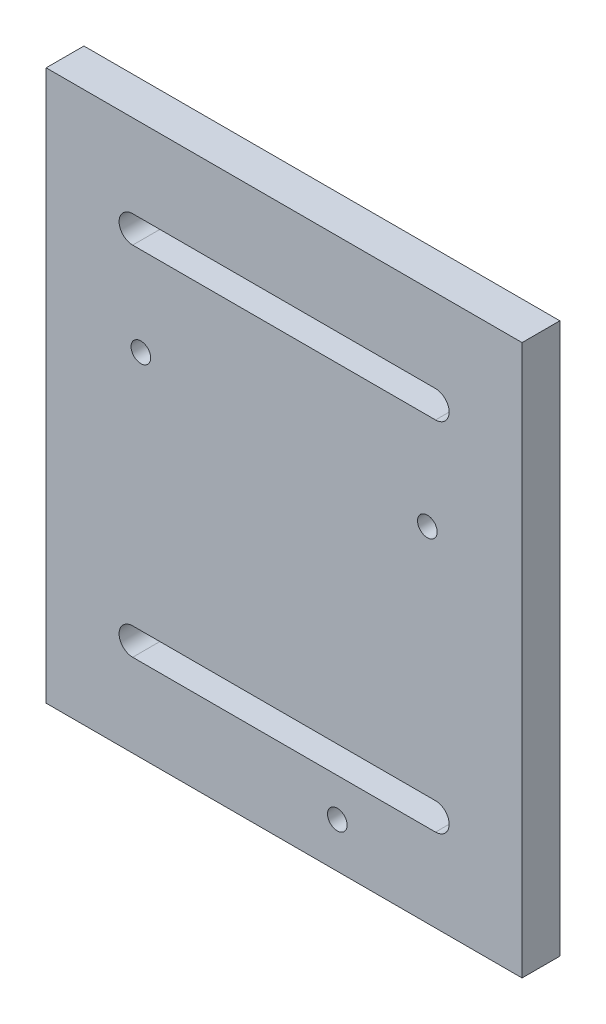
ISO-10303-21;
HEADER;
FILE_DESCRIPTION(('STEP AP214'),'2;1');
FILE_NAME('part.step','',(''),(''),'','','');
FILE_SCHEMA(('AUTOMOTIVE_DESIGN { 1 0 10303 214 1 1 1 1 }'));
ENDSEC;
DATA;
#1=APPLICATION_CONTEXT('core data for automotive mechanical design processes');
#2=APPLICATION_PROTOCOL_DEFINITION('international standard','automotive_design',2000,#1);
#3=PRODUCT_CONTEXT('',#1,'mechanical');
#4=PRODUCT('Part','Part','',(#3));
#5=PRODUCT_RELATED_PRODUCT_CATEGORY('part','',(#4));
#6=PRODUCT_DEFINITION_FORMATION('','',#4);
#7=PRODUCT_DEFINITION_CONTEXT('part definition',#1,'design');
#8=PRODUCT_DEFINITION('design','',#6,#7);
#9=PRODUCT_DEFINITION_SHAPE('','',#8);
#10=(LENGTH_UNIT() NAMED_UNIT(*) SI_UNIT(.MILLI.,.METRE.));
#11=(NAMED_UNIT(*) PLANE_ANGLE_UNIT() SI_UNIT($,.RADIAN.));
#12=(NAMED_UNIT(*) SI_UNIT($,.STERADIAN.) SOLID_ANGLE_UNIT());
#13=UNCERTAINTY_MEASURE_WITH_UNIT(LENGTH_MEASURE(1.E-05),#10,'distance_accuracy_value','');
#14=(GEOMETRIC_REPRESENTATION_CONTEXT(3) GLOBAL_UNCERTAINTY_ASSIGNED_CONTEXT((#13)) GLOBAL_UNIT_ASSIGNED_CONTEXT((#10,
#11,#12)) REPRESENTATION_CONTEXT('',''));
#15=CARTESIAN_POINT('',(0.,0.,0.));
#16=DIRECTION('',(0.,0.,1.));
#17=DIRECTION('',(1.,0.,0.));
#18=AXIS2_PLACEMENT_3D('',#15,#16,#17);
#19=CARTESIAN_POINT('',(0.,0.,6.35));
#20=DIRECTION('',(0.,0.,-1.));
#21=DIRECTION('',(-1.,0.,0.));
#22=AXIS2_PLACEMENT_3D('',#19,#20,#21);
#23=PLANE('',#22);
#24=CARTESIAN_POINT('',(-25.4545454545455,30.,6.35));
#25=DIRECTION('',(0.,0.,1.));
#26=DIRECTION('',(1.,0.,0.));
#27=AXIS2_PLACEMENT_3D('',#24,#25,#26);
#28=CIRCLE('',#27,2.28500000000001);
#29=CARTESIAN_POINT('',(-25.4545454545455,32.285,6.35));
#30=VERTEX_POINT('',#29);
#31=CARTESIAN_POINT('',(-25.4545454545455,27.715,6.35));
#32=VERTEX_POINT('',#31);
#33=EDGE_CURVE('E161',#30,#32,#28,.T.);
#34=ORIENTED_EDGE('',*,*,#33,.F.);
#35=DIRECTION('',(-1.,0.,0.));
#36=VECTOR('',#35,1.);
#37=CARTESIAN_POINT('',(-25.4545454545455,32.285,6.35));
#38=LINE('',#37,#36);
#39=CARTESIAN_POINT('',(25.4545454545455,32.285,6.35));
#40=VERTEX_POINT('',#39);
#41=EDGE_CURVE('E169',#40,#30,#38,.T.);
#42=ORIENTED_EDGE('',*,*,#41,.F.);
#43=CARTESIAN_POINT('',(25.4545454545455,30.,6.35));
#44=DIRECTION('',(0.,0.,1.));
#45=DIRECTION('',(1.,0.,0.));
#46=AXIS2_PLACEMENT_3D('',#43,#44,#45);
#47=CIRCLE('',#46,2.28500000000001);
#48=CARTESIAN_POINT('',(25.4545454545455,27.715,6.35));
#49=VERTEX_POINT('',#48);
#50=EDGE_CURVE('E166',#49,#40,#47,.T.);
#51=ORIENTED_EDGE('',*,*,#50,.F.);
#52=DIRECTION('',(1.,0.,0.));
#53=VECTOR('',#52,1.);
#54=CARTESIAN_POINT('',(-25.4545454545455,27.715,6.35));
#55=LINE('',#54,#53);
#56=EDGE_CURVE('E163',#32,#49,#55,.T.);
#57=ORIENTED_EDGE('',*,*,#56,.F.);
#58=EDGE_LOOP('',(#34,#42,#51,#57));
#59=FACE_BOUND('',#58,.T.);
#60=DIRECTION('',(0.,-1.,0.));
#61=VECTOR('',#60,1.);
#62=CARTESIAN_POINT('',(-40.,-46.25,6.35));
#63=LINE('',#62,#61);
#64=CARTESIAN_POINT('',(-40.,46.25,6.35));
#65=VERTEX_POINT('',#64);
#66=CARTESIAN_POINT('',(-40.,-46.25,6.35));
#67=VERTEX_POINT('',#66);
#68=EDGE_CURVE('E192',#65,#67,#63,.T.);
#69=ORIENTED_EDGE('',*,*,#68,.T.);
#70=DIRECTION('',(1.,0.,0.));
#71=VECTOR('',#70,1.);
#72=CARTESIAN_POINT('',(-40.,-46.25,6.35));
#73=LINE('',#72,#71);
#74=CARTESIAN_POINT('',(40.,-46.25,6.35));
#75=VERTEX_POINT('',#74);
#76=EDGE_CURVE('E195',#67,#75,#73,.T.);
#77=ORIENTED_EDGE('',*,*,#76,.T.);
#78=DIRECTION('',(0.,1.,0.));
#79=VECTOR('',#78,1.);
#80=CARTESIAN_POINT('',(40.,-46.25,6.35));
#81=LINE('',#80,#79);
#82=CARTESIAN_POINT('',(40.,46.25,6.35));
#83=VERTEX_POINT('',#82);
#84=EDGE_CURVE('E198',#75,#83,#81,.T.);
#85=ORIENTED_EDGE('',*,*,#84,.T.);
#86=DIRECTION('',(-1.,0.,0.));
#87=VECTOR('',#86,1.);
#88=CARTESIAN_POINT('',(-40.,46.25,6.35));
#89=LINE('',#88,#87);
#90=EDGE_CURVE('E200',#83,#65,#89,.T.);
#91=ORIENTED_EDGE('',*,*,#90,.T.);
#92=EDGE_LOOP('',(#69,#77,#85,#91));
#93=FACE_BOUND('',#92,.T.);
#94=CARTESIAN_POINT('',(-25.4545454545455,-30.,6.35));
#95=DIRECTION('',(0.,0.,1.));
#96=DIRECTION('',(1.,0.,0.));
#97=AXIS2_PLACEMENT_3D('',#94,#95,#96);
#98=CIRCLE('',#97,2.285);
#99=CARTESIAN_POINT('',(-25.4545454545455,-27.715,6.35));
#100=VERTEX_POINT('',#99);
#101=CARTESIAN_POINT('',(-25.4545454545455,-32.285,6.35));
#102=VERTEX_POINT('',#101);
#103=EDGE_CURVE('E122',#100,#102,#98,.T.);
#104=ORIENTED_EDGE('',*,*,#103,.F.);
#105=DIRECTION('',(-1.,0.,0.));
#106=VECTOR('',#105,1.);
#107=CARTESIAN_POINT('',(-25.4545454545455,-27.715,6.35));
#108=LINE('',#107,#106);
#109=CARTESIAN_POINT('',(25.4545454545455,-27.715,6.35));
#110=VERTEX_POINT('',#109);
#111=EDGE_CURVE('E145',#110,#100,#108,.T.);
#112=ORIENTED_EDGE('',*,*,#111,.F.);
#113=CARTESIAN_POINT('',(25.4545454545455,-30.,6.35));
#114=DIRECTION('',(0.,0.,1.));
#115=DIRECTION('',(1.,0.,0.));
#116=AXIS2_PLACEMENT_3D('',#113,#114,#115);
#117=CIRCLE('',#116,2.285);
#118=CARTESIAN_POINT('',(25.4545454545455,-32.285,6.35));
#119=VERTEX_POINT('',#118);
#120=EDGE_CURVE('E143',#119,#110,#117,.T.);
#121=ORIENTED_EDGE('',*,*,#120,.F.);
#122=DIRECTION('',(1.,0.,0.));
#123=VECTOR('',#122,1.);
#124=CARTESIAN_POINT('',(-25.4545454545455,-32.285,6.35));
#125=LINE('',#124,#123);
#126=EDGE_CURVE('E130',#102,#119,#125,.T.);
#127=ORIENTED_EDGE('',*,*,#126,.F.);
#128=EDGE_LOOP('',(#104,#112,#121,#127));
#129=FACE_BOUND('',#128,.T.);
#130=CARTESIAN_POINT('',(-24.08,12.8,6.35));
#131=DIRECTION('',(0.,0.,1.));
#132=DIRECTION('',(1.,0.,0.));
#133=AXIS2_PLACEMENT_3D('',#130,#131,#132);
#134=CIRCLE('',#133,1.65);
#135=CARTESIAN_POINT('',(-22.43,12.8,6.35));
#136=VERTEX_POINT('',#135);
#137=EDGE_CURVE('E151',#136,#136,#134,.T.);
#138=ORIENTED_EDGE('',*,*,#137,.F.);
#139=EDGE_LOOP('',(#138));
#140=FACE_BOUND('',#139,.T.);
#141=CARTESIAN_POINT('',(24.08,11.53,6.35));
#142=DIRECTION('',(0.,0.,1.));
#143=DIRECTION('',(1.,0.,0.));
#144=AXIS2_PLACEMENT_3D('',#141,#142,#143);
#145=CIRCLE('',#144,1.65);
#146=CARTESIAN_POINT('',(25.73,11.53,6.35));
#147=VERTEX_POINT('',#146);
#148=EDGE_CURVE('E321',#147,#147,#145,.T.);
#149=ORIENTED_EDGE('',*,*,#148,.F.);
#150=EDGE_LOOP('',(#149));
#151=FACE_BOUND('',#150,.T.);
#152=CARTESIAN_POINT('',(8.94,-38.71,6.35));
#153=DIRECTION('',(0.,0.,1.));
#154=DIRECTION('',(1.,0.,0.));
#155=AXIS2_PLACEMENT_3D('',#152,#153,#154);
#156=CIRCLE('',#155,1.65);
#157=CARTESIAN_POINT('',(10.59,-38.71,6.35));
#158=VERTEX_POINT('',#157);
#159=EDGE_CURVE('E312',#158,#158,#156,.T.);
#160=ORIENTED_EDGE('',*,*,#159,.F.);
#161=EDGE_LOOP('',(#160));
#162=FACE_BOUND('',#161,.T.);
#163=ADVANCED_FACE('F33',(#59,#93,#129,#140,#151,#162),#23,.F.);
#164=CARTESIAN_POINT('',(0.,0.,0.));
#165=DIRECTION('',(0.,0.,-1.));
#166=DIRECTION('',(-1.,0.,0.));
#167=AXIS2_PLACEMENT_3D('',#164,#165,#166);
#168=PLANE('',#167);
#169=CARTESIAN_POINT('',(24.08,11.53,0.));
#170=DIRECTION('',(0.,0.,1.));
#171=DIRECTION('',(1.,0.,0.));
#172=AXIS2_PLACEMENT_3D('',#169,#170,#171);
#173=CIRCLE('',#172,1.65);
#174=CARTESIAN_POINT('',(25.73,11.53,0.));
#175=VERTEX_POINT('',#174);
#176=EDGE_CURVE('E318',#175,#175,#173,.T.);
#177=ORIENTED_EDGE('',*,*,#176,.T.);
#178=EDGE_LOOP('',(#177));
#179=FACE_BOUND('',#178,.T.);
#180=DIRECTION('',(-1.,0.,0.));
#181=VECTOR('',#180,1.);
#182=CARTESIAN_POINT('',(-25.4545454545455,-27.715,0.));
#183=LINE('',#182,#181);
#184=CARTESIAN_POINT('',(25.4545454545455,-27.715,0.));
#185=VERTEX_POINT('',#184);
#186=CARTESIAN_POINT('',(-25.4545454545455,-27.715,0.));
#187=VERTEX_POINT('',#186);
#188=EDGE_CURVE('E131',#185,#187,#183,.T.);
#189=ORIENTED_EDGE('',*,*,#188,.T.);
#190=CARTESIAN_POINT('',(-25.4545454545455,-30.,0.));
#191=DIRECTION('',(0.,0.,1.));
#192=DIRECTION('',(1.,0.,0.));
#193=AXIS2_PLACEMENT_3D('',#190,#191,#192);
#194=CIRCLE('',#193,2.285);
#195=CARTESIAN_POINT('',(-25.4545454545455,-32.285,0.));
#196=VERTEX_POINT('',#195);
#197=EDGE_CURVE('E56',#187,#196,#194,.T.);
#198=ORIENTED_EDGE('',*,*,#197,.T.);
#199=DIRECTION('',(1.,0.,0.));
#200=VECTOR('',#199,1.);
#201=CARTESIAN_POINT('',(-25.4545454545455,-32.285,0.));
#202=LINE('',#201,#200);
#203=CARTESIAN_POINT('',(25.4545454545455,-32.285,0.));
#204=VERTEX_POINT('',#203);
#205=EDGE_CURVE('E137',#196,#204,#202,.T.);
#206=ORIENTED_EDGE('',*,*,#205,.T.);
#207=CARTESIAN_POINT('',(25.4545454545455,-30.,0.));
#208=DIRECTION('',(0.,0.,1.));
#209=DIRECTION('',(1.,0.,0.));
#210=AXIS2_PLACEMENT_3D('',#207,#208,#209);
#211=CIRCLE('',#210,2.285);
#212=EDGE_CURVE('E153',#204,#185,#211,.T.);
#213=ORIENTED_EDGE('',*,*,#212,.T.);
#214=EDGE_LOOP('',(#189,#198,#206,#213));
#215=FACE_BOUND('',#214,.T.);
#216=DIRECTION('',(-1.,0.,0.));
#217=VECTOR('',#216,1.);
#218=CARTESIAN_POINT('',(-25.4545454545455,32.285,0.));
#219=LINE('',#218,#217);
#220=CARTESIAN_POINT('',(25.4545454545455,32.285,0.));
#221=VERTEX_POINT('',#220);
#222=CARTESIAN_POINT('',(-25.4545454545455,32.285,0.));
#223=VERTEX_POINT('',#222);
#224=EDGE_CURVE('E164',#221,#223,#219,.T.);
#225=ORIENTED_EDGE('',*,*,#224,.T.);
#226=CARTESIAN_POINT('',(-25.4545454545455,30.,0.));
#227=DIRECTION('',(0.,0.,1.));
#228=DIRECTION('',(1.,0.,0.));
#229=AXIS2_PLACEMENT_3D('',#226,#227,#228);
#230=CIRCLE('',#229,2.28500000000001);
#231=CARTESIAN_POINT('',(-25.4545454545455,27.715,0.));
#232=VERTEX_POINT('',#231);
#233=EDGE_CURVE('E138',#223,#232,#230,.T.);
#234=ORIENTED_EDGE('',*,*,#233,.T.);
#235=DIRECTION('',(1.,0.,0.));
#236=VECTOR('',#235,1.);
#237=CARTESIAN_POINT('',(-25.4545454545455,27.715,0.));
#238=LINE('',#237,#236);
#239=CARTESIAN_POINT('',(25.4545454545455,27.715,0.));
#240=VERTEX_POINT('',#239);
#241=EDGE_CURVE('E174',#232,#240,#238,.T.);
#242=ORIENTED_EDGE('',*,*,#241,.T.);
#243=CARTESIAN_POINT('',(25.4545454545455,30.,0.));
#244=DIRECTION('',(0.,0.,1.));
#245=DIRECTION('',(1.,0.,0.));
#246=AXIS2_PLACEMENT_3D('',#243,#244,#245);
#247=CIRCLE('',#246,2.28500000000001);
#248=EDGE_CURVE('E177',#240,#221,#247,.T.);
#249=ORIENTED_EDGE('',*,*,#248,.T.);
#250=EDGE_LOOP('',(#225,#234,#242,#249));
#251=FACE_BOUND('',#250,.T.);
#252=DIRECTION('',(0.,-1.,0.));
#253=VECTOR('',#252,1.);
#254=CARTESIAN_POINT('',(-40.,-46.25,0.));
#255=LINE('',#254,#253);
#256=CARTESIAN_POINT('',(-40.,46.25,0.));
#257=VERTEX_POINT('',#256);
#258=CARTESIAN_POINT('',(-40.,-46.25,0.));
#259=VERTEX_POINT('',#258);
#260=EDGE_CURVE('E191',#257,#259,#255,.T.);
#261=ORIENTED_EDGE('',*,*,#260,.F.);
#262=DIRECTION('',(-1.,0.,0.));
#263=VECTOR('',#262,1.);
#264=CARTESIAN_POINT('',(-40.,46.25,0.));
#265=LINE('',#264,#263);
#266=CARTESIAN_POINT('',(40.,46.25,0.));
#267=VERTEX_POINT('',#266);
#268=EDGE_CURVE('E196',#267,#257,#265,.T.);
#269=ORIENTED_EDGE('',*,*,#268,.F.);
#270=DIRECTION('',(0.,1.,0.));
#271=VECTOR('',#270,1.);
#272=CARTESIAN_POINT('',(40.,-46.25,0.));
#273=LINE('',#272,#271);
#274=CARTESIAN_POINT('',(40.,-46.25,0.));
#275=VERTEX_POINT('',#274);
#276=EDGE_CURVE('E207',#275,#267,#273,.T.);
#277=ORIENTED_EDGE('',*,*,#276,.F.);
#278=DIRECTION('',(1.,0.,0.));
#279=VECTOR('',#278,1.);
#280=CARTESIAN_POINT('',(-40.,-46.25,0.));
#281=LINE('',#280,#279);
#282=EDGE_CURVE('E205',#259,#275,#281,.T.);
#283=ORIENTED_EDGE('',*,*,#282,.F.);
#284=EDGE_LOOP('',(#261,#269,#277,#283));
#285=FACE_BOUND('',#284,.T.);
#286=CARTESIAN_POINT('',(-24.08,12.8,0.));
#287=DIRECTION('',(0.,0.,1.));
#288=DIRECTION('',(1.,0.,0.));
#289=AXIS2_PLACEMENT_3D('',#286,#287,#288);
#290=CIRCLE('',#289,1.65);
#291=CARTESIAN_POINT('',(-22.43,12.8,0.));
#292=VERTEX_POINT('',#291);
#293=EDGE_CURVE('E324',#292,#292,#290,.T.);
#294=ORIENTED_EDGE('',*,*,#293,.T.);
#295=EDGE_LOOP('',(#294));
#296=FACE_BOUND('',#295,.T.);
#297=CARTESIAN_POINT('',(8.94,-38.71,0.));
#298=DIRECTION('',(0.,0.,1.));
#299=DIRECTION('',(1.,0.,0.));
#300=AXIS2_PLACEMENT_3D('',#297,#298,#299);
#301=CIRCLE('',#300,1.65);
#302=CARTESIAN_POINT('',(10.59,-38.71,0.));
#303=VERTEX_POINT('',#302);
#304=EDGE_CURVE('E315',#303,#303,#301,.T.);
#305=ORIENTED_EDGE('',*,*,#304,.T.);
#306=EDGE_LOOP('',(#305));
#307=FACE_BOUND('',#306,.T.);
#308=ADVANCED_FACE('F225',(#179,#215,#251,#285,#296,#307),#168,.T.);
#309=CARTESIAN_POINT('',(-40.,-46.25,6.35));
#310=DIRECTION('',(1.,0.,0.));
#311=DIRECTION('',(0.,0.,-1.));
#312=AXIS2_PLACEMENT_3D('',#309,#310,#311);
#313=PLANE('',#312);
#314=ORIENTED_EDGE('',*,*,#260,.T.);
#315=DIRECTION('',(0.,0.,-1.));
#316=VECTOR('',#315,1.);
#317=CARTESIAN_POINT('',(-40.,-46.25,6.35));
#318=LINE('',#317,#316);
#319=EDGE_CURVE('E11',#67,#259,#318,.T.);
#320=ORIENTED_EDGE('',*,*,#319,.F.);
#321=ORIENTED_EDGE('',*,*,#68,.F.);
#322=DIRECTION('',(0.,0.,-1.));
#323=VECTOR('',#322,1.);
#324=CARTESIAN_POINT('',(-40.,46.25,6.35));
#325=LINE('',#324,#323);
#326=EDGE_CURVE('E202',#65,#257,#325,.T.);
#327=ORIENTED_EDGE('',*,*,#326,.T.);
#328=EDGE_LOOP('',(#314,#320,#321,#327));
#329=FACE_BOUND('',#328,.T.);
#330=ADVANCED_FACE('F35',(#329),#313,.F.);
#331=CARTESIAN_POINT('',(-40.,-46.25,6.35));
#332=DIRECTION('',(0.,1.,0.));
#333=DIRECTION('',(0.,0.,1.));
#334=AXIS2_PLACEMENT_3D('',#331,#332,#333);
#335=PLANE('',#334);
#336=ORIENTED_EDGE('',*,*,#282,.T.);
#337=DIRECTION('',(0.,0.,-1.));
#338=VECTOR('',#337,1.);
#339=CARTESIAN_POINT('',(40.,-46.25,6.35));
#340=LINE('',#339,#338);
#341=EDGE_CURVE('E41',#75,#275,#340,.T.);
#342=ORIENTED_EDGE('',*,*,#341,.F.);
#343=ORIENTED_EDGE('',*,*,#76,.F.);
#344=ORIENTED_EDGE('',*,*,#319,.T.);
#345=EDGE_LOOP('',(#336,#342,#343,#344));
#346=FACE_BOUND('',#345,.T.);
#347=ADVANCED_FACE('F235',(#346),#335,.F.);
#348=CARTESIAN_POINT('',(40.,-46.25,6.35));
#349=DIRECTION('',(-1.,0.,0.));
#350=DIRECTION('',(0.,-1.,0.));
#351=AXIS2_PLACEMENT_3D('',#348,#349,#350);
#352=PLANE('',#351);
#353=ORIENTED_EDGE('',*,*,#276,.T.);
#354=DIRECTION('',(0.,0.,-1.));
#355=VECTOR('',#354,1.);
#356=CARTESIAN_POINT('',(40.,46.25,6.35));
#357=LINE('',#356,#355);
#358=EDGE_CURVE('E212',#83,#267,#357,.T.);
#359=ORIENTED_EDGE('',*,*,#358,.F.);
#360=ORIENTED_EDGE('',*,*,#84,.F.);
#361=ORIENTED_EDGE('',*,*,#341,.T.);
#362=EDGE_LOOP('',(#353,#359,#360,#361));
#363=FACE_BOUND('',#362,.T.);
#364=ADVANCED_FACE('F219',(#363),#352,.F.);
#365=CARTESIAN_POINT('',(-40.,46.25,6.35));
#366=DIRECTION('',(0.,-1.,0.));
#367=DIRECTION('',(0.,0.,-1.));
#368=AXIS2_PLACEMENT_3D('',#365,#366,#367);
#369=PLANE('',#368);
#370=ORIENTED_EDGE('',*,*,#268,.T.);
#371=ORIENTED_EDGE('',*,*,#326,.F.);
#372=ORIENTED_EDGE('',*,*,#90,.F.);
#373=ORIENTED_EDGE('',*,*,#358,.T.);
#374=EDGE_LOOP('',(#370,#371,#372,#373));
#375=FACE_BOUND('',#374,.T.);
#376=ADVANCED_FACE('F229',(#375),#369,.F.);
#377=CARTESIAN_POINT('',(-25.4545454545455,30.,6.35));
#378=DIRECTION('',(0.,0.,-1.));
#379=DIRECTION('',(-1.,0.,0.));
#380=AXIS2_PLACEMENT_3D('',#377,#378,#379);
#381=CYLINDRICAL_SURFACE('',#380,2.28500000000001);
#382=ORIENTED_EDGE('',*,*,#233,.F.);
#383=DIRECTION('',(0.,0.,-1.));
#384=VECTOR('',#383,1.);
#385=CARTESIAN_POINT('',(-25.4545454545455,32.285,6.35));
#386=LINE('',#385,#384);
#387=EDGE_CURVE('E171',#30,#223,#386,.T.);
#388=ORIENTED_EDGE('',*,*,#387,.F.);
#389=ORIENTED_EDGE('',*,*,#33,.T.);
#390=DIRECTION('',(0.,0.,-1.));
#391=VECTOR('',#390,1.);
#392=CARTESIAN_POINT('',(-25.4545454545455,27.715,6.35));
#393=LINE('',#392,#391);
#394=EDGE_CURVE('E188',#32,#232,#393,.T.);
#395=ORIENTED_EDGE('',*,*,#394,.T.);
#396=EDGE_LOOP('',(#382,#388,#389,#395));
#397=FACE_BOUND('',#396,.T.);
#398=ADVANCED_FACE('F252',(#397),#381,.F.);
#399=CARTESIAN_POINT('',(-25.4545454545455,27.715,6.35));
#400=DIRECTION('',(0.,1.,0.));
#401=DIRECTION('',(0.,0.,1.));
#402=AXIS2_PLACEMENT_3D('',#399,#400,#401);
#403=PLANE('',#402);
#404=ORIENTED_EDGE('',*,*,#241,.F.);
#405=ORIENTED_EDGE('',*,*,#394,.F.);
#406=ORIENTED_EDGE('',*,*,#56,.T.);
#407=DIRECTION('',(0.,0.,-1.));
#408=VECTOR('',#407,1.);
#409=CARTESIAN_POINT('',(25.4545454545455,27.715,6.35));
#410=LINE('',#409,#408);
#411=EDGE_CURVE('E186',#49,#240,#410,.T.);
#412=ORIENTED_EDGE('',*,*,#411,.T.);
#413=EDGE_LOOP('',(#404,#405,#406,#412));
#414=FACE_BOUND('',#413,.T.);
#415=ADVANCED_FACE('F259',(#414),#403,.T.);
#416=CARTESIAN_POINT('',(25.4545454545455,30.,6.35));
#417=DIRECTION('',(0.,0.,-1.));
#418=DIRECTION('',(-1.,0.,0.));
#419=AXIS2_PLACEMENT_3D('',#416,#417,#418);
#420=CYLINDRICAL_SURFACE('',#419,2.28500000000001);
#421=ORIENTED_EDGE('',*,*,#248,.F.);
#422=ORIENTED_EDGE('',*,*,#411,.F.);
#423=ORIENTED_EDGE('',*,*,#50,.T.);
#424=DIRECTION('',(0.,0.,-1.));
#425=VECTOR('',#424,1.);
#426=CARTESIAN_POINT('',(25.4545454545455,32.285,6.35));
#427=LINE('',#426,#425);
#428=EDGE_CURVE('E184',#40,#221,#427,.T.);
#429=ORIENTED_EDGE('',*,*,#428,.T.);
#430=EDGE_LOOP('',(#421,#422,#423,#429));
#431=FACE_BOUND('',#430,.T.);
#432=ADVANCED_FACE('F264',(#431),#420,.F.);
#433=CARTESIAN_POINT('',(-25.4545454545455,32.285,6.35));
#434=DIRECTION('',(0.,-1.,0.));
#435=DIRECTION('',(0.,0.,-1.));
#436=AXIS2_PLACEMENT_3D('',#433,#434,#435);
#437=PLANE('',#436);
#438=ORIENTED_EDGE('',*,*,#224,.F.);
#439=ORIENTED_EDGE('',*,*,#428,.F.);
#440=ORIENTED_EDGE('',*,*,#41,.T.);
#441=ORIENTED_EDGE('',*,*,#387,.T.);
#442=EDGE_LOOP('',(#438,#439,#440,#441));
#443=FACE_BOUND('',#442,.T.);
#444=ADVANCED_FACE('F271',(#443),#437,.T.);
#445=CARTESIAN_POINT('',(-25.4545454545455,-30.,6.35));
#446=DIRECTION('',(0.,0.,-1.));
#447=DIRECTION('',(-1.,0.,0.));
#448=AXIS2_PLACEMENT_3D('',#445,#446,#447);
#449=CYLINDRICAL_SURFACE('',#448,2.285);
#450=ORIENTED_EDGE('',*,*,#197,.F.);
#451=DIRECTION('',(0.,0.,-1.));
#452=VECTOR('',#451,1.);
#453=CARTESIAN_POINT('',(-25.4545454545455,-27.715,6.35));
#454=LINE('',#453,#452);
#455=EDGE_CURVE('E126',#100,#187,#454,.T.);
#456=ORIENTED_EDGE('',*,*,#455,.F.);
#457=ORIENTED_EDGE('',*,*,#103,.T.);
#458=DIRECTION('',(0.,0.,-1.));
#459=VECTOR('',#458,1.);
#460=CARTESIAN_POINT('',(-25.4545454545455,-32.285,6.35));
#461=LINE('',#460,#459);
#462=EDGE_CURVE('E125',#102,#196,#461,.T.);
#463=ORIENTED_EDGE('',*,*,#462,.T.);
#464=EDGE_LOOP('',(#450,#456,#457,#463));
#465=FACE_BOUND('',#464,.T.);
#466=ADVANCED_FACE('F124',(#465),#449,.F.);
#467=CARTESIAN_POINT('',(-25.4545454545455,-32.285,6.35));
#468=DIRECTION('',(0.,1.,0.));
#469=DIRECTION('',(0.,0.,1.));
#470=AXIS2_PLACEMENT_3D('',#467,#468,#469);
#471=PLANE('',#470);
#472=ORIENTED_EDGE('',*,*,#205,.F.);
#473=ORIENTED_EDGE('',*,*,#462,.F.);
#474=ORIENTED_EDGE('',*,*,#126,.T.);
#475=DIRECTION('',(0.,0.,-1.));
#476=VECTOR('',#475,1.);
#477=CARTESIAN_POINT('',(25.4545454545455,-32.285,6.35));
#478=LINE('',#477,#476);
#479=EDGE_CURVE('E139',#119,#204,#478,.T.);
#480=ORIENTED_EDGE('',*,*,#479,.T.);
#481=EDGE_LOOP('',(#472,#473,#474,#480));
#482=FACE_BOUND('',#481,.T.);
#483=ADVANCED_FACE('F134',(#482),#471,.T.);
#484=CARTESIAN_POINT('',(25.4545454545455,-30.,6.35));
#485=DIRECTION('',(0.,0.,-1.));
#486=DIRECTION('',(-1.,0.,0.));
#487=AXIS2_PLACEMENT_3D('',#484,#485,#486);
#488=CYLINDRICAL_SURFACE('',#487,2.285);
#489=ORIENTED_EDGE('',*,*,#212,.F.);
#490=ORIENTED_EDGE('',*,*,#479,.F.);
#491=ORIENTED_EDGE('',*,*,#120,.T.);
#492=DIRECTION('',(0.,0.,-1.));
#493=VECTOR('',#492,1.);
#494=CARTESIAN_POINT('',(25.4545454545455,-27.715,6.35));
#495=LINE('',#494,#493);
#496=EDGE_CURVE('E48',#110,#185,#495,.T.);
#497=ORIENTED_EDGE('',*,*,#496,.T.);
#498=EDGE_LOOP('',(#489,#490,#491,#497));
#499=FACE_BOUND('',#498,.T.);
#500=ADVANCED_FACE('F289',(#499),#488,.F.);
#501=CARTESIAN_POINT('',(-25.4545454545455,-27.715,6.35));
#502=DIRECTION('',(0.,-1.,0.));
#503=DIRECTION('',(0.,0.,-1.));
#504=AXIS2_PLACEMENT_3D('',#501,#502,#503);
#505=PLANE('',#504);
#506=ORIENTED_EDGE('',*,*,#188,.F.);
#507=ORIENTED_EDGE('',*,*,#496,.F.);
#508=ORIENTED_EDGE('',*,*,#111,.T.);
#509=ORIENTED_EDGE('',*,*,#455,.T.);
#510=EDGE_LOOP('',(#506,#507,#508,#509));
#511=FACE_BOUND('',#510,.T.);
#512=ADVANCED_FACE('F292',(#511),#505,.T.);
#513=CARTESIAN_POINT('',(-24.08,12.8,6.35));
#514=DIRECTION('',(0.,0.,-1.));
#515=DIRECTION('',(-1.,0.,0.));
#516=AXIS2_PLACEMENT_3D('',#513,#514,#515);
#517=CYLINDRICAL_SURFACE('',#516,1.65);
#518=ORIENTED_EDGE('',*,*,#137,.T.);
#519=EDGE_LOOP('',(#518));
#520=FACE_BOUND('',#519,.T.);
#521=ORIENTED_EDGE('',*,*,#293,.F.);
#522=EDGE_LOOP('',(#521));
#523=FACE_BOUND('',#522,.T.);
#524=ADVANCED_FACE('F296',(#520,#523),#517,.F.);
#525=CARTESIAN_POINT('',(24.08,11.53,6.35));
#526=DIRECTION('',(0.,0.,-1.));
#527=DIRECTION('',(-1.,0.,0.));
#528=AXIS2_PLACEMENT_3D('',#525,#526,#527);
#529=CYLINDRICAL_SURFACE('',#528,1.65);
#530=ORIENTED_EDGE('',*,*,#148,.T.);
#531=EDGE_LOOP('',(#530));
#532=FACE_BOUND('',#531,.T.);
#533=ORIENTED_EDGE('',*,*,#176,.F.);
#534=EDGE_LOOP('',(#533));
#535=FACE_BOUND('',#534,.T.);
#536=ADVANCED_FACE('F299',(#532,#535),#529,.F.);
#537=CARTESIAN_POINT('',(8.94,-38.71,6.35));
#538=DIRECTION('',(0.,0.,-1.));
#539=DIRECTION('',(-1.,0.,0.));
#540=AXIS2_PLACEMENT_3D('',#537,#538,#539);
#541=CYLINDRICAL_SURFACE('',#540,1.65);
#542=ORIENTED_EDGE('',*,*,#159,.T.);
#543=EDGE_LOOP('',(#542));
#544=FACE_BOUND('',#543,.T.);
#545=ORIENTED_EDGE('',*,*,#304,.F.);
#546=EDGE_LOOP('',(#545));
#547=FACE_BOUND('',#546,.T.);
#548=ADVANCED_FACE('F303',(#544,#547),#541,.F.);
#549=CLOSED_SHELL('',(#163,#308,#330,#347,#364,#376,#398,#415,#432,#444,#466,#483,#500,#512,
#524,#536,#548));
#550=MANIFOLD_SOLID_BREP('B2',#549);
#551=ADVANCED_BREP_SHAPE_REPRESENTATION('',(#18,#550),#14);
#552=SHAPE_DEFINITION_REPRESENTATION(#9,#551);
ENDSEC;
END-ISO-10303-21;
